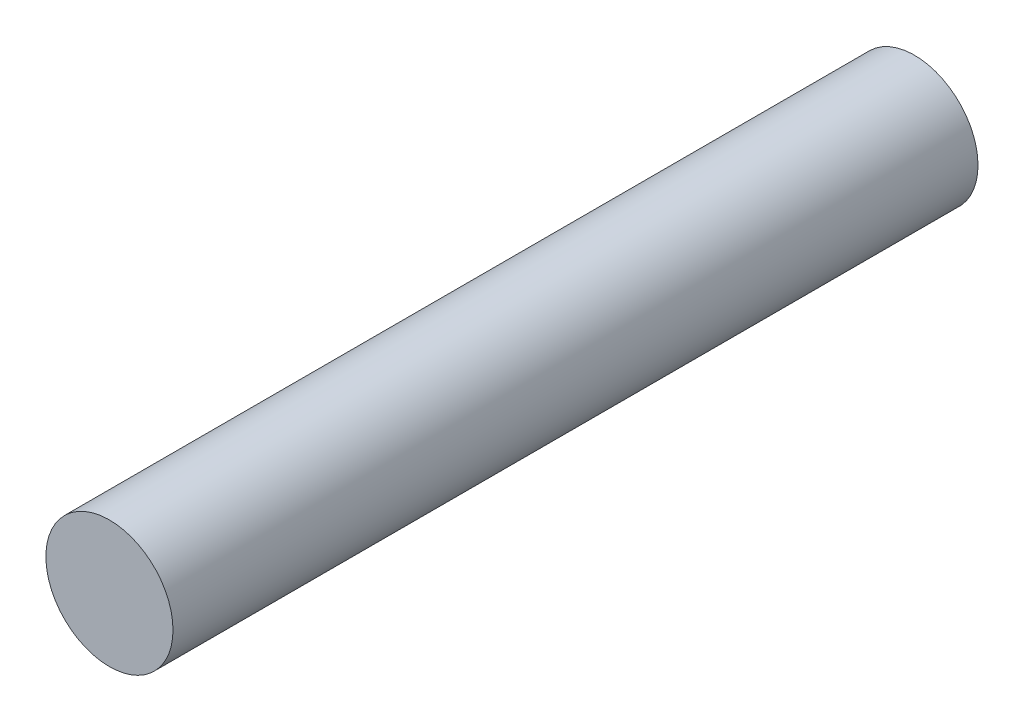
ISO-10303-21;
HEADER;
FILE_DESCRIPTION(('STEP AP214'),'2;1');
FILE_NAME('part.step','',(''),(''),'','','');
FILE_SCHEMA(('AUTOMOTIVE_DESIGN { 1 0 10303 214 1 1 1 1 }'));
ENDSEC;
DATA;
#1=APPLICATION_CONTEXT('core data for automotive mechanical design processes');
#2=APPLICATION_PROTOCOL_DEFINITION('international standard','automotive_design',2000,#1);
#3=PRODUCT_CONTEXT('',#1,'mechanical');
#4=PRODUCT('Part','Part','',(#3));
#5=PRODUCT_RELATED_PRODUCT_CATEGORY('part','',(#4));
#6=PRODUCT_DEFINITION_FORMATION('','',#4);
#7=PRODUCT_DEFINITION_CONTEXT('part definition',#1,'design');
#8=PRODUCT_DEFINITION('design','',#6,#7);
#9=PRODUCT_DEFINITION_SHAPE('','',#8);
#10=(LENGTH_UNIT() NAMED_UNIT(*) SI_UNIT(.MILLI.,.METRE.));
#11=(NAMED_UNIT(*) PLANE_ANGLE_UNIT() SI_UNIT($,.RADIAN.));
#12=(NAMED_UNIT(*) SI_UNIT($,.STERADIAN.) SOLID_ANGLE_UNIT());
#13=UNCERTAINTY_MEASURE_WITH_UNIT(LENGTH_MEASURE(1.E-05),#10,'distance_accuracy_value','');
#14=(GEOMETRIC_REPRESENTATION_CONTEXT(3) GLOBAL_UNCERTAINTY_ASSIGNED_CONTEXT((#13)) GLOBAL_UNIT_ASSIGNED_CONTEXT((#10,
#11,#12)) REPRESENTATION_CONTEXT('',''));
#15=CARTESIAN_POINT('',(0.,0.,0.));
#16=DIRECTION('',(0.,0.,1.));
#17=DIRECTION('',(1.,0.,0.));
#18=AXIS2_PLACEMENT_3D('',#15,#16,#17);
#19=CARTESIAN_POINT('',(0.,0.,76.));
#20=DIRECTION('',(0.,0.,-1.));
#21=DIRECTION('',(-1.,0.,0.));
#22=AXIS2_PLACEMENT_3D('',#19,#20,#21);
#23=CYLINDRICAL_SURFACE('',#22,6.);
#24=CARTESIAN_POINT('',(0.,0.,76.));
#25=DIRECTION('',(0.,0.,1.));
#26=DIRECTION('',(1.,0.,0.));
#27=AXIS2_PLACEMENT_3D('',#24,#25,#26);
#28=CIRCLE('',#27,6.);
#29=CARTESIAN_POINT('',(6.,0.,76.));
#30=VERTEX_POINT('',#29);
#31=EDGE_CURVE('E10',#30,#30,#28,.T.);
#32=ORIENTED_EDGE('',*,*,#31,.F.);
#33=EDGE_LOOP('',(#32));
#34=FACE_BOUND('',#33,.T.);
#35=CARTESIAN_POINT('',(0.,0.,0.));
#36=DIRECTION('',(0.,0.,1.));
#37=DIRECTION('',(1.,0.,0.));
#38=AXIS2_PLACEMENT_3D('',#35,#36,#37);
#39=CIRCLE('',#38,6.);
#40=CARTESIAN_POINT('',(6.,0.,0.));
#41=VERTEX_POINT('',#40);
#42=EDGE_CURVE('E46',#41,#41,#39,.T.);
#43=ORIENTED_EDGE('',*,*,#42,.T.);
#44=EDGE_LOOP('',(#43));
#45=FACE_BOUND('',#44,.T.);
#46=ADVANCED_FACE('F43',(#34,#45),#23,.T.);
#47=CARTESIAN_POINT('',(0.,0.,76.));
#48=DIRECTION('',(0.,0.,1.));
#49=DIRECTION('',(1.,0.,0.));
#50=AXIS2_PLACEMENT_3D('',#47,#48,#49);
#51=PLANE('',#50);
#52=ORIENTED_EDGE('',*,*,#31,.T.);
#53=EDGE_LOOP('',(#52));
#54=FACE_BOUND('',#53,.T.);
#55=ADVANCED_FACE('F58',(#54),#51,.T.);
#56=CARTESIAN_POINT('',(0.,0.,0.));
#57=DIRECTION('',(0.,0.,1.));
#58=DIRECTION('',(1.,0.,0.));
#59=AXIS2_PLACEMENT_3D('',#56,#57,#58);
#60=PLANE('',#59);
#61=ORIENTED_EDGE('',*,*,#42,.F.);
#62=EDGE_LOOP('',(#61));
#63=FACE_BOUND('',#62,.T.);
#64=ADVANCED_FACE('F59',(#63),#60,.F.);
#65=CLOSED_SHELL('',(#46,#55,#64));
#66=MANIFOLD_SOLID_BREP('B2',#65);
#67=ADVANCED_BREP_SHAPE_REPRESENTATION('',(#18,#66),#14);
#68=SHAPE_DEFINITION_REPRESENTATION(#9,#67);
ENDSEC;
END-ISO-10303-21;
